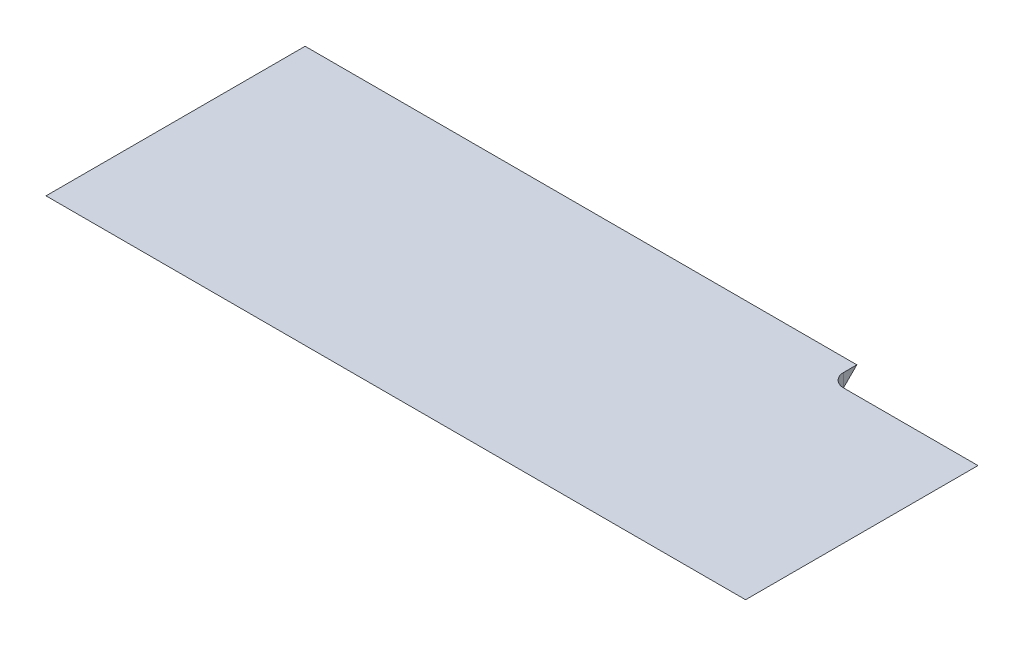
ISO-10303-21;
HEADER;
FILE_DESCRIPTION(('STEP AP214'),'2;1');
FILE_NAME('part.step','',(''),(''),'','','');
FILE_SCHEMA(('AUTOMOTIVE_DESIGN { 1 0 10303 214 1 1 1 1 }'));
ENDSEC;
DATA;
#1=APPLICATION_CONTEXT('core data for automotive mechanical design processes');
#2=APPLICATION_PROTOCOL_DEFINITION('international standard','automotive_design',2000,#1);
#3=PRODUCT_CONTEXT('',#1,'mechanical');
#4=PRODUCT('Part','Part','',(#3));
#5=PRODUCT_RELATED_PRODUCT_CATEGORY('part','',(#4));
#6=PRODUCT_DEFINITION_FORMATION('','',#4);
#7=PRODUCT_DEFINITION_CONTEXT('part definition',#1,'design');
#8=PRODUCT_DEFINITION('design','',#6,#7);
#9=PRODUCT_DEFINITION_SHAPE('','',#8);
#10=(LENGTH_UNIT() NAMED_UNIT(*) SI_UNIT(.MILLI.,.METRE.));
#11=(NAMED_UNIT(*) PLANE_ANGLE_UNIT() SI_UNIT($,.RADIAN.));
#12=(NAMED_UNIT(*) SI_UNIT($,.STERADIAN.) SOLID_ANGLE_UNIT());
#13=UNCERTAINTY_MEASURE_WITH_UNIT(LENGTH_MEASURE(1.E-05),#10,'distance_accuracy_value','');
#14=(GEOMETRIC_REPRESENTATION_CONTEXT(3) GLOBAL_UNCERTAINTY_ASSIGNED_CONTEXT((#13)) GLOBAL_UNIT_ASSIGNED_CONTEXT((#10,
#11,#12)) REPRESENTATION_CONTEXT('',''));
#15=CARTESIAN_POINT('',(0.,0.,0.));
#16=DIRECTION('',(0.,0.,1.));
#17=DIRECTION('',(1.,0.,0.));
#18=AXIS2_PLACEMENT_3D('',#15,#16,#17);
#19=CARTESIAN_POINT('',(0.,-12.7,0.));
#20=DIRECTION('',(0.,1.,0.));
#21=DIRECTION('',(0.,0.,1.));
#22=AXIS2_PLACEMENT_3D('',#19,#20,#21);
#23=PLANE('',#22);
#24=DIRECTION('',(-1.,0.,0.));
#25=VECTOR('',#24,1.);
#26=CARTESIAN_POINT('',(0.,-12.7,-50.8000000000005));
#27=LINE('',#26,#25);
#28=CARTESIAN_POINT('',(89.7890000000005,-12.7,-50.8000000000005));
#29=VERTEX_POINT('',#28);
#30=CARTESIAN_POINT('',(24.1300000000016,-12.7,-50.8000000000005));
#31=VERTEX_POINT('',#30);
#32=EDGE_CURVE('E200',#29,#31,#27,.T.);
#33=ORIENTED_EDGE('',*,*,#32,.F.);
#34=DIRECTION('',(0.,0.,-1.));
#35=VECTOR('',#34,1.);
#36=CARTESIAN_POINT('',(89.7890000000005,-12.7,-37.3380000000014));
#37=LINE('',#36,#35);
#38=CARTESIAN_POINT('',(89.7890000000005,-12.7,-37.3380000000014));
#39=VERTEX_POINT('',#38);
#40=EDGE_CURVE('E250',#39,#29,#37,.T.);
#41=ORIENTED_EDGE('',*,*,#40,.F.);
#42=DIRECTION('',(-1.,0.,0.));
#43=VECTOR('',#42,1.);
#44=CARTESIAN_POINT('',(171.449999999999,-12.7,-37.3380000000014));
#45=LINE('',#44,#43);
#46=CARTESIAN_POINT('',(158.749999999999,-12.7,-37.3380000000014));
#47=VERTEX_POINT('',#46);
#48=EDGE_CURVE('E246',#47,#39,#45,.T.);
#49=ORIENTED_EDGE('',*,*,#48,.F.);
#50=DIRECTION('',(0.,0.,-1.));
#51=VECTOR('',#50,1.);
#52=CARTESIAN_POINT('',(158.749999999999,-12.7,0.));
#53=LINE('',#52,#51);
#54=CARTESIAN_POINT('',(158.749999999999,-12.7,50.8000000000005));
#55=VERTEX_POINT('',#54);
#56=EDGE_CURVE('E204',#55,#47,#53,.T.);
#57=ORIENTED_EDGE('',*,*,#56,.F.);
#58=DIRECTION('',(1.,0.,0.));
#59=VECTOR('',#58,1.);
#60=CARTESIAN_POINT('',(0.,-12.7,50.8000000000005));
#61=LINE('',#60,#59);
#62=CARTESIAN_POINT('',(24.1300000000017,-12.7,50.8000000000005));
#63=VERTEX_POINT('',#62);
#64=EDGE_CURVE('E210',#63,#55,#61,.T.);
#65=ORIENTED_EDGE('',*,*,#64,.F.);
#66=DIRECTION('',(0.,0.,-1.));
#67=VECTOR('',#66,1.);
#68=CARTESIAN_POINT('',(24.1300000000017,-12.7,0.));
#69=LINE('',#68,#67);
#70=EDGE_CURVE('E215',#63,#31,#69,.T.);
#71=ORIENTED_EDGE('',*,*,#70,.T.);
#72=EDGE_LOOP('',(#33,#41,#49,#57,#65,#71));
#73=FACE_BOUND('',#72,.T.);
#74=ADVANCED_FACE('F43',(#73),#23,.F.);
#75=CARTESIAN_POINT('',(-171.449999999999,0.,-63.5000000000006));
#76=DIRECTION('',(-0.707106781186546,-0.707106781186549,0.));
#77=DIRECTION('',(0.707106781186549,-0.707106781186546,0.));
#78=AXIS2_PLACEMENT_3D('',#75,#76,#77);
#79=PLANE('',#78);
#80=DIRECTION('',(0.,0.,1.));
#81=VECTOR('',#80,1.);
#82=CARTESIAN_POINT('',(-171.449999999999,0.,-63.5000000000006));
#83=LINE('',#82,#81);
#84=CARTESIAN_POINT('',(-171.449999999999,0.,-63.5000000000006));
#85=VERTEX_POINT('',#84);
#86=CARTESIAN_POINT('',(-171.449999999998,0.,63.5000000000006));
#87=VERTEX_POINT('',#86);
#88=EDGE_CURVE('E189',#85,#87,#83,.T.);
#89=ORIENTED_EDGE('',*,*,#88,.F.);
#90=DIRECTION('',(-0.577350269189627,0.577350269189624,-0.577350269189627));
#91=VECTOR('',#90,1.);
#92=CARTESIAN_POINT('',(-171.449999999999,0.,-63.5000000000006));
#93=LINE('',#92,#91);
#94=CARTESIAN_POINT('',(-158.749999999998,-12.7,-50.8000000000005));
#95=VERTEX_POINT('',#94);
#96=EDGE_CURVE('E193',#95,#85,#93,.T.);
#97=ORIENTED_EDGE('',*,*,#96,.F.);
#98=DIRECTION('',(0.,0.,1.));
#99=VECTOR('',#98,1.);
#100=CARTESIAN_POINT('',(-158.749999999998,-12.7,0.));
#101=LINE('',#100,#99);
#102=CARTESIAN_POINT('',(-158.749999999998,-12.7,50.8000000000005));
#103=VERTEX_POINT('',#102);
#104=EDGE_CURVE('E187',#95,#103,#101,.T.);
#105=ORIENTED_EDGE('',*,*,#104,.T.);
#106=DIRECTION('',(-0.577350269189626,0.577350269189624,0.577350269189627));
#107=VECTOR('',#106,1.);
#108=CARTESIAN_POINT('',(-129.116666666665,-42.3333333333337,21.1666666666668));
#109=LINE('',#108,#107);
#110=EDGE_CURVE('E198',#103,#87,#109,.T.);
#111=ORIENTED_EDGE('',*,*,#110,.T.);
#112=EDGE_LOOP('',(#89,#97,#105,#111));
#113=FACE_BOUND('',#112,.T.);
#114=ADVANCED_FACE('F301',(#113),#79,.T.);
#115=CARTESIAN_POINT('',(-171.449999999999,0.,-63.5000000000006));
#116=DIRECTION('',(0.,-0.707106781186549,-0.707106781186546));
#117=DIRECTION('',(0.,0.707106781186546,-0.707106781186549));
#118=AXIS2_PLACEMENT_3D('',#115,#116,#117);
#119=PLANE('',#118);
#120=DIRECTION('',(0.,0.707106781186546,-0.707106781186549));
#121=VECTOR('',#120,1.);
#122=CARTESIAN_POINT('',(98.9851743550846,0.,-63.5000000000006));
#123=LINE('',#122,#121);
#124=CARTESIAN_POINT('',(98.9851743550846,-6.47699999999916,-57.0230000000014));
#125=VERTEX_POINT('',#124);
#126=CARTESIAN_POINT('',(98.9851743550846,0.,-63.5000000000006));
#127=VERTEX_POINT('',#126);
#128=EDGE_CURVE('E179',#125,#127,#123,.T.);
#129=ORIENTED_EDGE('',*,*,#128,.F.);
#130=CARTESIAN_POINT('',(105.589174355085,-6.47699999999916,-57.0230000000014));
#131=DIRECTION('',(0.,-0.707106781186549,-0.707106781186546));
#132=DIRECTION('',(0.,0.707106781186546,-0.707106781186549));
#133=AXIS2_PLACEMENT_3D('',#130,#131,#132);
#134=ELLIPSE('',#133,9.3394663659119,6.604);
#135=CARTESIAN_POINT('',(99.0848398772154,-7.62,-55.8800000000005));
#136=VERTEX_POINT('',#135);
#137=EDGE_CURVE('E232',#125,#136,#134,.F.);
#138=ORIENTED_EDGE('',*,*,#137,.T.);
#139=DIRECTION('',(1.,0.,0.));
#140=VECTOR('',#139,1.);
#141=CARTESIAN_POINT('',(-171.449999999999,-7.62,-55.8800000000005));
#142=LINE('',#141,#140);
#143=CARTESIAN_POINT('',(89.7890000000005,-7.62,-55.8800000000005));
#144=VERTEX_POINT('',#143);
#145=EDGE_CURVE('E58',#144,#136,#142,.T.);
#146=ORIENTED_EDGE('',*,*,#145,.F.);
#147=DIRECTION('',(0.,0.707106781186546,-0.707106781186549));
#148=VECTOR('',#147,1.);
#149=CARTESIAN_POINT('',(89.7890000000005,0.,-63.5000000000006));
#150=LINE('',#149,#148);
#151=EDGE_CURVE('E224',#29,#144,#150,.T.);
#152=ORIENTED_EDGE('',*,*,#151,.F.);
#153=ORIENTED_EDGE('',*,*,#32,.T.);
#154=DIRECTION('',(0.,-0.707106781186546,0.707106781186549));
#155=VECTOR('',#154,1.);
#156=CARTESIAN_POINT('',(24.1300000000016,0.,-63.5000000000006));
#157=LINE('',#156,#155);
#158=CARTESIAN_POINT('',(24.1300000000016,-7.62,-55.8800000000005));
#159=VERTEX_POINT('',#158);
#160=EDGE_CURVE('E293',#159,#31,#157,.T.);
#161=ORIENTED_EDGE('',*,*,#160,.F.);
#162=DIRECTION('',(-1.,0.,0.));
#163=VECTOR('',#162,1.);
#164=CARTESIAN_POINT('',(-171.449999999999,-7.62,-55.8800000000005));
#165=LINE('',#164,#163);
#166=CARTESIAN_POINT('',(0.762000000001607,-7.62,-55.8800000000005));
#167=VERTEX_POINT('',#166);
#168=EDGE_CURVE('E296',#159,#167,#165,.T.);
#169=ORIENTED_EDGE('',*,*,#168,.T.);
#170=DIRECTION('',(0.,0.707106781186546,-0.707106781186549));
#171=VECTOR('',#170,1.);
#172=CARTESIAN_POINT('',(0.762000000001595,0.,-63.5000000000006));
#173=LINE('',#172,#171);
#174=CARTESIAN_POINT('',(0.76200000000161,-12.7,-50.8000000000005));
#175=VERTEX_POINT('',#174);
#176=EDGE_CURVE('E288',#175,#167,#173,.T.);
#177=ORIENTED_EDGE('',*,*,#176,.F.);
#178=EDGE_CURVE('E203',#175,#95,#27,.T.);
#179=ORIENTED_EDGE('',*,*,#178,.T.);
#180=ORIENTED_EDGE('',*,*,#96,.T.);
#181=DIRECTION('',(-1.,0.,0.));
#182=VECTOR('',#181,1.);
#183=CARTESIAN_POINT('',(-171.449999999999,0.,-63.5000000000006));
#184=LINE('',#183,#182);
#185=EDGE_CURVE('E185',#127,#85,#184,.T.);
#186=ORIENTED_EDGE('',*,*,#185,.F.);
#187=EDGE_LOOP('',(#129,#138,#146,#152,#153,#161,#169,#177,#179,#180,#186));
#188=FACE_BOUND('',#187,.T.);
#189=ADVANCED_FACE('F323',(#188),#119,.T.);
#190=CARTESIAN_POINT('',(171.449999999999,0.,-63.5000000000006));
#191=DIRECTION('',(0.707106781186546,-0.707106781186549,0.));
#192=DIRECTION('',(0.707106781186549,0.707106781186546,0.));
#193=AXIS2_PLACEMENT_3D('',#190,#191,#192);
#194=PLANE('',#193);
#195=DIRECTION('',(-0.707106781186549,-0.707106781186546,0.));
#196=VECTOR('',#195,1.);
#197=CARTESIAN_POINT('',(171.449999999999,0.,-50.4190000000014));
#198=LINE('',#197,#196);
#199=CARTESIAN_POINT('',(171.449999999999,0.,-50.4190000000014));
#200=VERTEX_POINT('',#199);
#201=CARTESIAN_POINT('',(163.829999999999,-7.62,-50.4190000000014));
#202=VERTEX_POINT('',#201);
#203=EDGE_CURVE('E164',#200,#202,#198,.T.);
#204=ORIENTED_EDGE('',*,*,#203,.F.);
#205=DIRECTION('',(0.,0.,-1.));
#206=VECTOR('',#205,1.);
#207=CARTESIAN_POINT('',(171.449999999999,0.,-63.5000000000006));
#208=LINE('',#207,#206);
#209=CARTESIAN_POINT('',(171.449999999999,0.,63.5000000000006));
#210=VERTEX_POINT('',#209);
#211=EDGE_CURVE('E175',#210,#200,#208,.T.);
#212=ORIENTED_EDGE('',*,*,#211,.F.);
#213=DIRECTION('',(0.577350269189627,0.577350269189624,0.577350269189627));
#214=VECTOR('',#213,1.);
#215=CARTESIAN_POINT('',(57.1499999999994,-114.299999999999,-50.7999999999988));
#216=LINE('',#215,#214);
#217=EDGE_CURVE('E197',#55,#210,#216,.T.);
#218=ORIENTED_EDGE('',*,*,#217,.F.);
#219=ORIENTED_EDGE('',*,*,#56,.T.);
#220=DIRECTION('',(-0.707106781186549,-0.707106781186546,0.));
#221=VECTOR('',#220,1.);
#222=CARTESIAN_POINT('',(171.449999999999,0.,-37.3380000000014));
#223=LINE('',#222,#221);
#224=CARTESIAN_POINT('',(163.829999999999,-7.62,-37.3380000000014));
#225=VERTEX_POINT('',#224);
#226=EDGE_CURVE('E222',#225,#47,#223,.T.);
#227=ORIENTED_EDGE('',*,*,#226,.F.);
#228=DIRECTION('',(0.,0.,1.));
#229=VECTOR('',#228,1.);
#230=CARTESIAN_POINT('',(163.829999999999,-7.62,-63.5000000000006));
#231=LINE('',#230,#229);
#232=EDGE_CURVE('E178',#202,#225,#231,.T.);
#233=ORIENTED_EDGE('',*,*,#232,.F.);
#234=EDGE_LOOP('',(#204,#212,#218,#219,#227,#233));
#235=FACE_BOUND('',#234,.T.);
#236=ADVANCED_FACE('F173',(#235),#194,.T.);
#237=CARTESIAN_POINT('',(-171.449999999998,0.,63.5000000000006));
#238=DIRECTION('',(0.,-0.707106781186549,0.707106781186546));
#239=DIRECTION('',(0.,-0.707106781186546,-0.707106781186549));
#240=AXIS2_PLACEMENT_3D('',#237,#238,#239);
#241=PLANE('',#240);
#242=DIRECTION('',(0.,-0.707106781186546,-0.707106781186549));
#243=VECTOR('',#242,1.);
#244=CARTESIAN_POINT('',(-19.4309999999997,0.,63.5000000000005));
#245=LINE('',#244,#243);
#246=CARTESIAN_POINT('',(-19.4309999999997,-7.62,55.8800000000013));
#247=VERTEX_POINT('',#246);
#248=CARTESIAN_POINT('',(-19.4309999999997,-12.7,50.8000000000005));
#249=VERTEX_POINT('',#248);
#250=EDGE_CURVE('E277',#247,#249,#245,.T.);
#251=ORIENTED_EDGE('',*,*,#250,.F.);
#252=DIRECTION('',(1.,0.,0.));
#253=VECTOR('',#252,1.);
#254=CARTESIAN_POINT('',(-171.449999999998,-7.62,55.8800000000005));
#255=LINE('',#254,#253);
#256=CARTESIAN_POINT('',(24.1300000000017,-7.62,55.8800000000005));
#257=VERTEX_POINT('',#256);
#258=EDGE_CURVE('E218',#247,#257,#255,.T.);
#259=ORIENTED_EDGE('',*,*,#258,.T.);
#260=DIRECTION('',(0.,0.707106781186546,0.707106781186549));
#261=VECTOR('',#260,1.);
#262=CARTESIAN_POINT('',(24.1300000000017,0.,63.5000000000005));
#263=LINE('',#262,#261);
#264=EDGE_CURVE('E291',#63,#257,#263,.T.);
#265=ORIENTED_EDGE('',*,*,#264,.F.);
#266=ORIENTED_EDGE('',*,*,#64,.T.);
#267=ORIENTED_EDGE('',*,*,#217,.T.);
#268=DIRECTION('',(1.,0.,0.));
#269=VECTOR('',#268,1.);
#270=CARTESIAN_POINT('',(-171.449999999998,0.,63.5000000000006));
#271=LINE('',#270,#269);
#272=EDGE_CURVE('E184',#87,#210,#271,.T.);
#273=ORIENTED_EDGE('',*,*,#272,.F.);
#274=ORIENTED_EDGE('',*,*,#110,.F.);
#275=EDGE_CURVE('E207',#103,#249,#61,.T.);
#276=ORIENTED_EDGE('',*,*,#275,.T.);
#277=EDGE_LOOP('',(#251,#259,#265,#266,#267,#273,#274,#276));
#278=FACE_BOUND('',#277,.T.);
#279=ADVANCED_FACE('F306',(#278),#241,.T.);
#280=CARTESIAN_POINT('',(-12.8269999999997,-12.7,30.9879999999996));
#281=DIRECTION('',(0.,-1.,0.));
#282=DIRECTION('',(0.,0.,-1.));
#283=AXIS2_PLACEMENT_3D('',#280,#281,#282);
#284=CIRCLE('',#283,6.604);
#285=CARTESIAN_POINT('',(-19.4309999999997,-12.7,30.9879999999996));
#286=VERTEX_POINT('',#285);
#287=CARTESIAN_POINT('',(-6.22299999999975,-12.7,30.9879999999996));
#288=VERTEX_POINT('',#287);
#289=EDGE_CURVE('E258',#286,#288,#284,.T.);
#290=ORIENTED_EDGE('',*,*,#289,.F.);
#291=DIRECTION('',(0.,0.,-1.));
#292=VECTOR('',#291,1.);
#293=CARTESIAN_POINT('',(-19.4309999999997,-12.7,55.8800000000013));
#294=LINE('',#293,#292);
#295=EDGE_CURVE('E263',#249,#286,#294,.T.);
#296=ORIENTED_EDGE('',*,*,#295,.F.);
#297=ORIENTED_EDGE('',*,*,#275,.F.);
#298=ORIENTED_EDGE('',*,*,#104,.F.);
#299=ORIENTED_EDGE('',*,*,#178,.F.);
#300=DIRECTION('',(0.,0.,1.));
#301=VECTOR('',#300,1.);
#302=CARTESIAN_POINT('',(0.762000000001643,-12.7,0.));
#303=LINE('',#302,#301);
#304=CARTESIAN_POINT('',(0.762000000001666,-12.7,30.9879999999996));
#305=VERTEX_POINT('',#304);
#306=EDGE_CURVE('E196',#175,#305,#303,.T.);
#307=ORIENTED_EDGE('',*,*,#306,.T.);
#308=DIRECTION('',(1.,0.,0.));
#309=VECTOR('',#308,1.);
#310=CARTESIAN_POINT('',(-6.22299999999975,-12.7,30.9879999999996));
#311=LINE('',#310,#309);
#312=EDGE_CURVE('E271',#288,#305,#311,.T.);
#313=ORIENTED_EDGE('',*,*,#312,.F.);
#314=EDGE_LOOP('',(#290,#296,#297,#298,#299,#307,#313));
#315=FACE_BOUND('',#314,.T.);
#316=ADVANCED_FACE('F328',(#315),#23,.F.);
#317=CARTESIAN_POINT('',(0.,0.,0.));
#318=DIRECTION('',(0.,1.,0.));
#319=DIRECTION('',(0.,0.,1.));
#320=AXIS2_PLACEMENT_3D('',#317,#318,#319);
#321=PLANE('',#320);
#322=DIRECTION('',(-1.,0.,0.));
#323=VECTOR('',#322,1.);
#324=CARTESIAN_POINT('',(98.9851743550846,0.,-50.4190000000014));
#325=LINE('',#324,#323);
#326=CARTESIAN_POINT('',(105.589174355085,0.,-50.4190000000014));
#327=VERTEX_POINT('',#326);
#328=EDGE_CURVE('E161',#200,#327,#325,.T.);
#329=ORIENTED_EDGE('',*,*,#328,.T.);
#330=CARTESIAN_POINT('',(105.589174355085,0.,-57.0230000000014));
#331=DIRECTION('',(0.,1.,0.));
#332=DIRECTION('',(0.,0.,1.));
#333=AXIS2_PLACEMENT_3D('',#330,#331,#332);
#334=CIRCLE('',#333,6.604);
#335=CARTESIAN_POINT('',(98.9851743550846,0.,-57.0230000000014));
#336=VERTEX_POINT('',#335);
#337=EDGE_CURVE('E11',#327,#336,#334,.F.);
#338=ORIENTED_EDGE('',*,*,#337,.T.);
#339=DIRECTION('',(0.,0.,-1.));
#340=VECTOR('',#339,1.);
#341=CARTESIAN_POINT('',(98.9851743550846,0.,-63.5000000000006));
#342=LINE('',#341,#340);
#343=EDGE_CURVE('E169',#336,#127,#342,.T.);
#344=ORIENTED_EDGE('',*,*,#343,.T.);
#345=ORIENTED_EDGE('',*,*,#185,.T.);
#346=ORIENTED_EDGE('',*,*,#88,.T.);
#347=ORIENTED_EDGE('',*,*,#272,.T.);
#348=ORIENTED_EDGE('',*,*,#211,.T.);
#349=EDGE_LOOP('',(#329,#338,#344,#345,#346,#347,#348));
#350=FACE_BOUND('',#349,.T.);
#351=ADVANCED_FACE('F181',(#350),#321,.T.);
#352=CARTESIAN_POINT('',(24.1300000000017,-7.62,63.5000000000006));
#353=DIRECTION('',(1.,0.,0.));
#354=DIRECTION('',(0.,0.,-1.));
#355=AXIS2_PLACEMENT_3D('',#352,#353,#354);
#356=PLANE('',#355);
#357=ORIENTED_EDGE('',*,*,#160,.T.);
#358=ORIENTED_EDGE('',*,*,#70,.F.);
#359=ORIENTED_EDGE('',*,*,#264,.T.);
#360=DIRECTION('',(0.,0.,1.));
#361=VECTOR('',#360,1.);
#362=CARTESIAN_POINT('',(24.1300000000017,-7.62,63.5000000000006));
#363=LINE('',#362,#361);
#364=EDGE_CURVE('E285',#159,#257,#363,.T.);
#365=ORIENTED_EDGE('',*,*,#364,.F.);
#366=EDGE_LOOP('',(#357,#358,#359,#365));
#367=FACE_BOUND('',#366,.T.);
#368=ADVANCED_FACE('F340',(#367),#356,.F.);
#369=CARTESIAN_POINT('',(0.762000000001685,-7.62,63.5000000000006));
#370=DIRECTION('',(-1.,0.,0.));
#371=DIRECTION('',(0.,0.,1.));
#372=AXIS2_PLACEMENT_3D('',#369,#370,#371);
#373=PLANE('',#372);
#374=DIRECTION('',(0.,0.,-1.));
#375=VECTOR('',#374,1.);
#376=CARTESIAN_POINT('',(0.762000000001685,-7.62,63.5000000000006));
#377=LINE('',#376,#375);
#378=CARTESIAN_POINT('',(0.762000000001664,-7.62,30.9879999999996));
#379=VERTEX_POINT('',#378);
#380=EDGE_CURVE('E283',#379,#167,#377,.T.);
#381=ORIENTED_EDGE('',*,*,#380,.F.);
#382=DIRECTION('',(0.,-1.,0.));
#383=VECTOR('',#382,1.);
#384=CARTESIAN_POINT('',(0.762000000001666,-7.62,30.9879999999996));
#385=LINE('',#384,#383);
#386=EDGE_CURVE('E278',#379,#305,#385,.T.);
#387=ORIENTED_EDGE('',*,*,#386,.T.);
#388=ORIENTED_EDGE('',*,*,#306,.F.);
#389=ORIENTED_EDGE('',*,*,#176,.T.);
#390=EDGE_LOOP('',(#381,#387,#388,#389));
#391=FACE_BOUND('',#390,.T.);
#392=ADVANCED_FACE('F342',(#391),#373,.F.);
#393=CARTESIAN_POINT('',(0.,-7.62,0.));
#394=DIRECTION('',(0.,-1.,0.));
#395=DIRECTION('',(0.,0.,-1.));
#396=AXIS2_PLACEMENT_3D('',#393,#394,#395);
#397=PLANE('',#396);
#398=ORIENTED_EDGE('',*,*,#364,.T.);
#399=ORIENTED_EDGE('',*,*,#258,.F.);
#400=DIRECTION('',(0.,0.,-1.));
#401=VECTOR('',#400,1.);
#402=CARTESIAN_POINT('',(-19.4309999999997,-7.62,55.8800000000013));
#403=LINE('',#402,#401);
#404=CARTESIAN_POINT('',(-19.4309999999997,-7.62,30.9879999999996));
#405=VERTEX_POINT('',#404);
#406=EDGE_CURVE('E265',#247,#405,#403,.T.);
#407=ORIENTED_EDGE('',*,*,#406,.T.);
#408=CARTESIAN_POINT('',(-12.8269999999997,-7.62,30.9879999999996));
#409=DIRECTION('',(0.,-1.,0.));
#410=DIRECTION('',(0.,0.,-1.));
#411=AXIS2_PLACEMENT_3D('',#408,#409,#410);
#412=CIRCLE('',#411,6.604);
#413=CARTESIAN_POINT('',(-6.22299999999975,-7.62,30.9879999999996));
#414=VERTEX_POINT('',#413);
#415=EDGE_CURVE('E259',#405,#414,#412,.T.);
#416=ORIENTED_EDGE('',*,*,#415,.T.);
#417=DIRECTION('',(1.,0.,0.));
#418=VECTOR('',#417,1.);
#419=CARTESIAN_POINT('',(-6.22299999999975,-7.62,30.9879999999996));
#420=LINE('',#419,#418);
#421=EDGE_CURVE('E262',#414,#379,#420,.T.);
#422=ORIENTED_EDGE('',*,*,#421,.T.);
#423=ORIENTED_EDGE('',*,*,#380,.T.);
#424=ORIENTED_EDGE('',*,*,#168,.F.);
#425=EDGE_LOOP('',(#398,#399,#407,#416,#422,#423,#424));
#426=FACE_BOUND('',#425,.T.);
#427=ADVANCED_FACE('F336',(#426),#397,.T.);
#428=CARTESIAN_POINT('',(-12.8269999999997,-7.62,30.9879999999996));
#429=DIRECTION('',(0.,-1.,0.));
#430=DIRECTION('',(0.,0.,-1.));
#431=AXIS2_PLACEMENT_3D('',#428,#429,#430);
#432=CYLINDRICAL_SURFACE('',#431,6.604);
#433=ORIENTED_EDGE('',*,*,#289,.T.);
#434=DIRECTION('',(0.,-1.,0.));
#435=VECTOR('',#434,1.);
#436=CARTESIAN_POINT('',(-6.22299999999975,-7.62,30.9879999999996));
#437=LINE('',#436,#435);
#438=EDGE_CURVE('E268',#414,#288,#437,.T.);
#439=ORIENTED_EDGE('',*,*,#438,.F.);
#440=ORIENTED_EDGE('',*,*,#415,.F.);
#441=DIRECTION('',(0.,-1.,0.));
#442=VECTOR('',#441,1.);
#443=CARTESIAN_POINT('',(-19.4309999999997,-7.62,30.9879999999996));
#444=LINE('',#443,#442);
#445=EDGE_CURVE('E274',#405,#286,#444,.T.);
#446=ORIENTED_EDGE('',*,*,#445,.T.);
#447=EDGE_LOOP('',(#433,#439,#440,#446));
#448=FACE_BOUND('',#447,.T.);
#449=ADVANCED_FACE('F441',(#448),#432,.F.);
#450=CARTESIAN_POINT('',(-19.4309999999997,-7.62,55.8800000000013));
#451=DIRECTION('',(-1.,0.,0.));
#452=DIRECTION('',(0.,0.,1.));
#453=AXIS2_PLACEMENT_3D('',#450,#451,#452);
#454=PLANE('',#453);
#455=ORIENTED_EDGE('',*,*,#250,.T.);
#456=ORIENTED_EDGE('',*,*,#295,.T.);
#457=ORIENTED_EDGE('',*,*,#445,.F.);
#458=ORIENTED_EDGE('',*,*,#406,.F.);
#459=EDGE_LOOP('',(#455,#456,#457,#458));
#460=FACE_BOUND('',#459,.T.);
#461=ADVANCED_FACE('F333',(#460),#454,.F.);
#462=CARTESIAN_POINT('',(-6.22299999999975,-7.62,30.9879999999996));
#463=DIRECTION('',(0.,0.,-1.));
#464=DIRECTION('',(-1.,0.,0.));
#465=AXIS2_PLACEMENT_3D('',#462,#463,#464);
#466=PLANE('',#465);
#467=ORIENTED_EDGE('',*,*,#312,.T.);
#468=ORIENTED_EDGE('',*,*,#386,.F.);
#469=ORIENTED_EDGE('',*,*,#421,.F.);
#470=ORIENTED_EDGE('',*,*,#438,.T.);
#471=EDGE_LOOP('',(#467,#468,#469,#470));
#472=FACE_BOUND('',#471,.T.);
#473=ADVANCED_FACE('F426',(#472),#466,.F.);
#474=CARTESIAN_POINT('',(89.7890000000005,-7.62,-37.3380000000014));
#475=DIRECTION('',(-1.,0.,0.));
#476=DIRECTION('',(0.,0.,1.));
#477=AXIS2_PLACEMENT_3D('',#474,#475,#476);
#478=PLANE('',#477);
#479=ORIENTED_EDGE('',*,*,#151,.T.);
#480=DIRECTION('',(0.,0.,-1.));
#481=VECTOR('',#480,1.);
#482=CARTESIAN_POINT('',(89.7890000000005,-7.62,-37.3380000000014));
#483=LINE('',#482,#481);
#484=CARTESIAN_POINT('',(89.7890000000005,-7.62,-37.3380000000014));
#485=VERTEX_POINT('',#484);
#486=EDGE_CURVE('E249',#485,#144,#483,.T.);
#487=ORIENTED_EDGE('',*,*,#486,.F.);
#488=DIRECTION('',(0.,-1.,0.));
#489=VECTOR('',#488,1.);
#490=CARTESIAN_POINT('',(89.7890000000005,-7.62,-37.3380000000014));
#491=LINE('',#490,#489);
#492=EDGE_CURVE('E252',#485,#39,#491,.T.);
#493=ORIENTED_EDGE('',*,*,#492,.T.);
#494=ORIENTED_EDGE('',*,*,#40,.T.);
#495=EDGE_LOOP('',(#479,#487,#493,#494));
#496=FACE_BOUND('',#495,.T.);
#497=ADVANCED_FACE('F320',(#496),#478,.F.);
#498=CARTESIAN_POINT('',(171.449999999999,-7.62,-37.3380000000014));
#499=DIRECTION('',(0.,0.,1.));
#500=DIRECTION('',(1.,0.,0.));
#501=AXIS2_PLACEMENT_3D('',#498,#499,#500);
#502=PLANE('',#501);
#503=ORIENTED_EDGE('',*,*,#226,.T.);
#504=ORIENTED_EDGE('',*,*,#48,.T.);
#505=ORIENTED_EDGE('',*,*,#492,.F.);
#506=DIRECTION('',(-1.,0.,0.));
#507=VECTOR('',#506,1.);
#508=CARTESIAN_POINT('',(171.449999999999,-7.62,-37.3380000000014));
#509=LINE('',#508,#507);
#510=EDGE_CURVE('E247',#225,#485,#509,.T.);
#511=ORIENTED_EDGE('',*,*,#510,.F.);
#512=EDGE_LOOP('',(#503,#504,#505,#511));
#513=FACE_BOUND('',#512,.T.);
#514=ADVANCED_FACE('F316',(#513),#502,.F.);
#515=CARTESIAN_POINT('',(0.,-7.62,0.));
#516=DIRECTION('',(0.,1.,0.));
#517=DIRECTION('',(0.,0.,1.));
#518=AXIS2_PLACEMENT_3D('',#515,#516,#517);
#519=PLANE('',#518);
#520=ORIENTED_EDGE('',*,*,#145,.T.);
#521=CARTESIAN_POINT('',(105.589174355085,-7.62,-57.0230000000014));
#522=DIRECTION('',(0.,1.,0.));
#523=DIRECTION('',(0.,0.,1.));
#524=AXIS2_PLACEMENT_3D('',#521,#522,#523);
#525=CIRCLE('',#524,6.604);
#526=CARTESIAN_POINT('',(105.589174355085,-7.62,-50.4190000000014));
#527=VERTEX_POINT('',#526);
#528=EDGE_CURVE('E51',#136,#527,#525,.T.);
#529=ORIENTED_EDGE('',*,*,#528,.T.);
#530=DIRECTION('',(1.,0.,0.));
#531=VECTOR('',#530,1.);
#532=CARTESIAN_POINT('',(0.,-7.62,-50.4190000000014));
#533=LINE('',#532,#531);
#534=EDGE_CURVE('E226',#527,#202,#533,.T.);
#535=ORIENTED_EDGE('',*,*,#534,.T.);
#536=ORIENTED_EDGE('',*,*,#232,.T.);
#537=ORIENTED_EDGE('',*,*,#510,.T.);
#538=ORIENTED_EDGE('',*,*,#486,.T.);
#539=EDGE_LOOP('',(#520,#529,#535,#536,#537,#538));
#540=FACE_BOUND('',#539,.T.);
#541=ADVANCED_FACE('F234',(#540),#519,.F.);
#542=CARTESIAN_POINT('',(98.9851743550846,0.,-63.5000000000006));
#543=DIRECTION('',(-1.,0.,0.));
#544=DIRECTION('',(0.,0.,1.));
#545=AXIS2_PLACEMENT_3D('',#542,#543,#544);
#546=PLANE('',#545);
#547=ORIENTED_EDGE('',*,*,#343,.F.);
#548=DIRECTION('',(0.,-1.,0.));
#549=VECTOR('',#548,1.);
#550=CARTESIAN_POINT('',(98.9851743550846,-7.62,-57.0230000000014));
#551=LINE('',#550,#549);
#552=EDGE_CURVE('E228',#336,#125,#551,.T.);
#553=ORIENTED_EDGE('',*,*,#552,.T.);
#554=ORIENTED_EDGE('',*,*,#128,.T.);
#555=EDGE_LOOP('',(#547,#553,#554));
#556=FACE_BOUND('',#555,.T.);
#557=ADVANCED_FACE('F240',(#556),#546,.F.);
#558=CARTESIAN_POINT('',(98.9851743550846,0.,-50.4190000000014));
#559=DIRECTION('',(0.,0.,1.));
#560=DIRECTION('',(1.,0.,0.));
#561=AXIS2_PLACEMENT_3D('',#558,#559,#560);
#562=PLANE('',#561);
#563=ORIENTED_EDGE('',*,*,#534,.F.);
#564=DIRECTION('',(0.,-1.,0.));
#565=VECTOR('',#564,1.);
#566=CARTESIAN_POINT('',(105.589174355085,0.,-50.4190000000014));
#567=LINE('',#566,#565);
#568=EDGE_CURVE('E66',#527,#327,#567,.F.);
#569=ORIENTED_EDGE('',*,*,#568,.T.);
#570=ORIENTED_EDGE('',*,*,#328,.F.);
#571=ORIENTED_EDGE('',*,*,#203,.T.);
#572=EDGE_LOOP('',(#563,#569,#570,#571));
#573=FACE_BOUND('',#572,.T.);
#574=ADVANCED_FACE('F163',(#573),#562,.F.);
#575=CARTESIAN_POINT('',(105.589174355085,0.,-57.0230000000014));
#576=DIRECTION('',(0.,1.,0.));
#577=DIRECTION('',(0.,0.,1.));
#578=AXIS2_PLACEMENT_3D('',#575,#576,#577);
#579=CYLINDRICAL_SURFACE('',#578,6.604);
#580=ORIENTED_EDGE('',*,*,#337,.F.);
#581=ORIENTED_EDGE('',*,*,#568,.F.);
#582=ORIENTED_EDGE('',*,*,#528,.F.);
#583=ORIENTED_EDGE('',*,*,#137,.F.);
#584=ORIENTED_EDGE('',*,*,#552,.F.);
#585=EDGE_LOOP('',(#580,#581,#582,#583,#584));
#586=FACE_BOUND('',#585,.T.);
#587=ADVANCED_FACE('F45',(#586),#579,.F.);
#588=CLOSED_SHELL('',(#74,#114,#189,#236,#279,#316,#351,#368,#392,#427,#449,#461,#473,#497,#514,
#541,#557,#574,#587));
#589=MANIFOLD_SOLID_BREP('B2',#588);
#590=ADVANCED_BREP_SHAPE_REPRESENTATION('',(#18,#589),#14);
#591=SHAPE_DEFINITION_REPRESENTATION(#9,#590);
ENDSEC;
END-ISO-10303-21;
